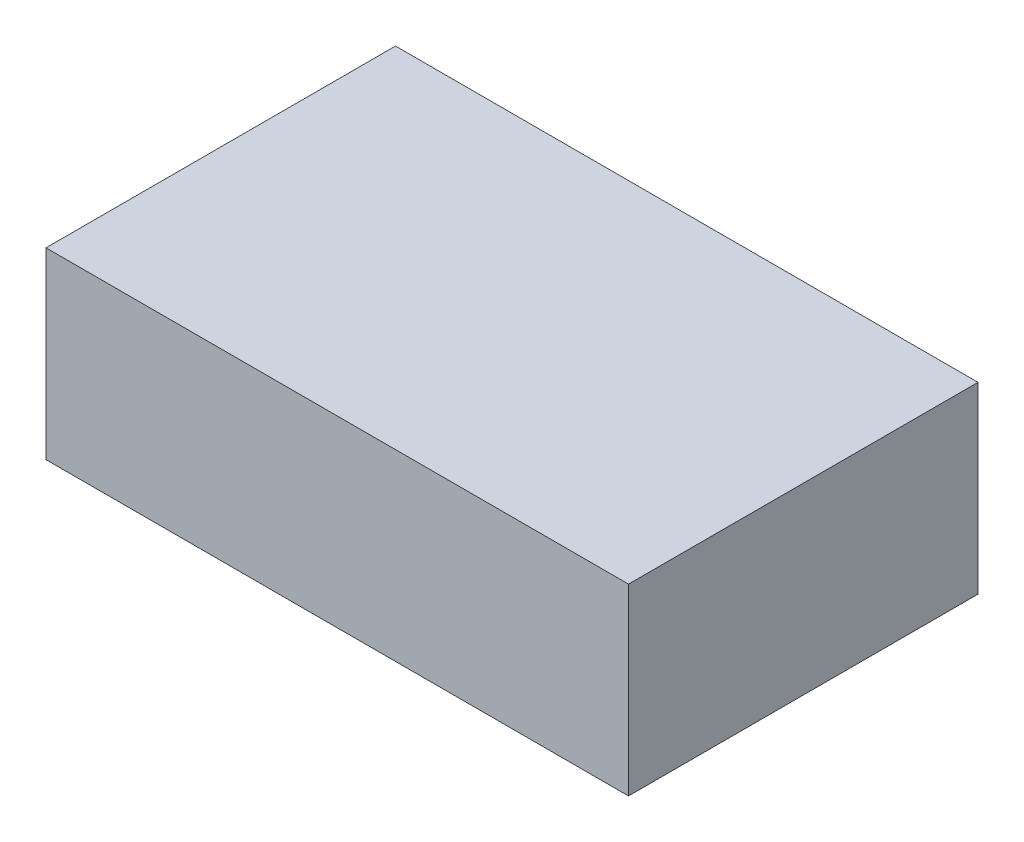
ISO-10303-21;
HEADER;
FILE_DESCRIPTION(('STEP AP214'),'2;1');
FILE_NAME('part.step','',(''),(''),'','','');
FILE_SCHEMA(('AUTOMOTIVE_DESIGN { 1 0 10303 214 1 1 1 1 }'));
ENDSEC;
DATA;
#1=APPLICATION_CONTEXT('core data for automotive mechanical design processes');
#2=APPLICATION_PROTOCOL_DEFINITION('international standard','automotive_design',2000,#1);
#3=PRODUCT_CONTEXT('',#1,'mechanical');
#4=PRODUCT('Part','Part','',(#3));
#5=PRODUCT_RELATED_PRODUCT_CATEGORY('part','',(#4));
#6=PRODUCT_DEFINITION_FORMATION('','',#4);
#7=PRODUCT_DEFINITION_CONTEXT('part definition',#1,'design');
#8=PRODUCT_DEFINITION('design','',#6,#7);
#9=PRODUCT_DEFINITION_SHAPE('','',#8);
#10=(LENGTH_UNIT() NAMED_UNIT(*) SI_UNIT(.MILLI.,.METRE.));
#11=(NAMED_UNIT(*) PLANE_ANGLE_UNIT() SI_UNIT($,.RADIAN.));
#12=(NAMED_UNIT(*) SI_UNIT($,.STERADIAN.) SOLID_ANGLE_UNIT());
#13=UNCERTAINTY_MEASURE_WITH_UNIT(LENGTH_MEASURE(1.E-05),#10,'distance_accuracy_value','');
#14=(GEOMETRIC_REPRESENTATION_CONTEXT(3) GLOBAL_UNCERTAINTY_ASSIGNED_CONTEXT((#13)) GLOBAL_UNIT_ASSIGNED_CONTEXT((#10,
#11,#12)) REPRESENTATION_CONTEXT('',''));
#15=CARTESIAN_POINT('',(0.,0.,0.));
#16=DIRECTION('',(0.,0.,1.));
#17=DIRECTION('',(1.,0.,0.));
#18=AXIS2_PLACEMENT_3D('',#15,#16,#17);
#19=CARTESIAN_POINT('',(0.,12.,0.));
#20=DIRECTION('',(1.,0.,0.));
#21=DIRECTION('',(0.,0.,-1.));
#22=AXIS2_PLACEMENT_3D('',#19,#20,#21);
#23=PLANE('',#22);
#24=DIRECTION('',(0.,0.,1.));
#25=VECTOR('',#24,1.);
#26=CARTESIAN_POINT('',(0.,0.,0.));
#27=LINE('',#26,#25);
#28=CARTESIAN_POINT('',(0.,0.,-22.86));
#29=VERTEX_POINT('',#28);
#30=CARTESIAN_POINT('',(0.,0.,0.));
#31=VERTEX_POINT('',#30);
#32=EDGE_CURVE('E95',#29,#31,#27,.T.);
#33=ORIENTED_EDGE('',*,*,#32,.T.);
#34=DIRECTION('',(0.,-1.,0.));
#35=VECTOR('',#34,1.);
#36=CARTESIAN_POINT('',(0.,12.,0.));
#37=LINE('',#36,#35);
#38=CARTESIAN_POINT('',(0.,12.,0.));
#39=VERTEX_POINT('',#38);
#40=EDGE_CURVE('E11',#39,#31,#37,.T.);
#41=ORIENTED_EDGE('',*,*,#40,.F.);
#42=DIRECTION('',(0.,0.,1.));
#43=VECTOR('',#42,1.);
#44=CARTESIAN_POINT('',(0.,12.,0.));
#45=LINE('',#44,#43);
#46=CARTESIAN_POINT('',(0.,12.,-22.86));
#47=VERTEX_POINT('',#46);
#48=EDGE_CURVE('E83',#47,#39,#45,.T.);
#49=ORIENTED_EDGE('',*,*,#48,.F.);
#50=DIRECTION('',(0.,-1.,0.));
#51=VECTOR('',#50,1.);
#52=CARTESIAN_POINT('',(0.,12.,-22.86));
#53=LINE('',#52,#51);
#54=EDGE_CURVE('E91',#47,#29,#53,.T.);
#55=ORIENTED_EDGE('',*,*,#54,.T.);
#56=EDGE_LOOP('',(#33,#41,#49,#55));
#57=FACE_BOUND('',#56,.T.);
#58=ADVANCED_FACE('F32',(#57),#23,.F.);
#59=CARTESIAN_POINT('',(0.,12.,0.));
#60=DIRECTION('',(0.,0.,-1.));
#61=DIRECTION('',(-1.,0.,0.));
#62=AXIS2_PLACEMENT_3D('',#59,#60,#61);
#63=PLANE('',#62);
#64=DIRECTION('',(1.,0.,0.));
#65=VECTOR('',#64,1.);
#66=CARTESIAN_POINT('',(0.,0.,0.));
#67=LINE('',#66,#65);
#68=CARTESIAN_POINT('',(38.1,0.,0.));
#69=VERTEX_POINT('',#68);
#70=EDGE_CURVE('E87',#31,#69,#67,.T.);
#71=ORIENTED_EDGE('',*,*,#70,.T.);
#72=DIRECTION('',(0.,-1.,0.));
#73=VECTOR('',#72,1.);
#74=CARTESIAN_POINT('',(38.1,12.,0.));
#75=LINE('',#74,#73);
#76=CARTESIAN_POINT('',(38.1,12.,0.));
#77=VERTEX_POINT('',#76);
#78=EDGE_CURVE('E40',#77,#69,#75,.T.);
#79=ORIENTED_EDGE('',*,*,#78,.F.);
#80=DIRECTION('',(1.,0.,0.));
#81=VECTOR('',#80,1.);
#82=CARTESIAN_POINT('',(0.,12.,0.));
#83=LINE('',#82,#81);
#84=EDGE_CURVE('E78',#39,#77,#83,.T.);
#85=ORIENTED_EDGE('',*,*,#84,.F.);
#86=ORIENTED_EDGE('',*,*,#40,.T.);
#87=EDGE_LOOP('',(#71,#79,#85,#86));
#88=FACE_BOUND('',#87,.T.);
#89=ADVANCED_FACE('F86',(#88),#63,.F.);
#90=CARTESIAN_POINT('',(38.1,12.,0.));
#91=DIRECTION('',(-1.,0.,0.));
#92=DIRECTION('',(0.,0.,1.));
#93=AXIS2_PLACEMENT_3D('',#90,#91,#92);
#94=PLANE('',#93);
#95=DIRECTION('',(0.,0.,-1.));
#96=VECTOR('',#95,1.);
#97=CARTESIAN_POINT('',(38.1,0.,0.));
#98=LINE('',#97,#96);
#99=CARTESIAN_POINT('',(38.1,0.,-22.86));
#100=VERTEX_POINT('',#99);
#101=EDGE_CURVE('E65',#69,#100,#98,.T.);
#102=ORIENTED_EDGE('',*,*,#101,.T.);
#103=DIRECTION('',(0.,-1.,0.));
#104=VECTOR('',#103,1.);
#105=CARTESIAN_POINT('',(38.1,12.,-22.86));
#106=LINE('',#105,#104);
#107=CARTESIAN_POINT('',(38.1,12.,-22.86));
#108=VERTEX_POINT('',#107);
#109=EDGE_CURVE('E88',#108,#100,#106,.T.);
#110=ORIENTED_EDGE('',*,*,#109,.F.);
#111=DIRECTION('',(0.,0.,-1.));
#112=VECTOR('',#111,1.);
#113=CARTESIAN_POINT('',(38.1,12.,0.));
#114=LINE('',#113,#112);
#115=EDGE_CURVE('E81',#77,#108,#114,.T.);
#116=ORIENTED_EDGE('',*,*,#115,.F.);
#117=ORIENTED_EDGE('',*,*,#78,.T.);
#118=EDGE_LOOP('',(#102,#110,#116,#117));
#119=FACE_BOUND('',#118,.T.);
#120=ADVANCED_FACE('F89',(#119),#94,.F.);
#121=CARTESIAN_POINT('',(0.,12.,-22.86));
#122=DIRECTION('',(0.,0.,1.));
#123=DIRECTION('',(1.,0.,0.));
#124=AXIS2_PLACEMENT_3D('',#121,#122,#123);
#125=PLANE('',#124);
#126=DIRECTION('',(-1.,0.,0.));
#127=VECTOR('',#126,1.);
#128=CARTESIAN_POINT('',(0.,0.,-22.86));
#129=LINE('',#128,#127);
#130=EDGE_CURVE('E71',#100,#29,#129,.T.);
#131=ORIENTED_EDGE('',*,*,#130,.T.);
#132=ORIENTED_EDGE('',*,*,#54,.F.);
#133=DIRECTION('',(-1.,0.,0.));
#134=VECTOR('',#133,1.);
#135=CARTESIAN_POINT('',(0.,12.,-22.86));
#136=LINE('',#135,#134);
#137=EDGE_CURVE('E48',#108,#47,#136,.T.);
#138=ORIENTED_EDGE('',*,*,#137,.F.);
#139=ORIENTED_EDGE('',*,*,#109,.T.);
#140=EDGE_LOOP('',(#131,#132,#138,#139));
#141=FACE_BOUND('',#140,.T.);
#142=ADVANCED_FACE('F102',(#141),#125,.F.);
#143=CARTESIAN_POINT('',(0.,12.,0.));
#144=DIRECTION('',(0.,-1.,0.));
#145=DIRECTION('',(0.,0.,-1.));
#146=AXIS2_PLACEMENT_3D('',#143,#144,#145);
#147=PLANE('',#146);
#148=ORIENTED_EDGE('',*,*,#48,.T.);
#149=ORIENTED_EDGE('',*,*,#84,.T.);
#150=ORIENTED_EDGE('',*,*,#115,.T.);
#151=ORIENTED_EDGE('',*,*,#137,.T.);
#152=EDGE_LOOP('',(#148,#149,#150,#151));
#153=FACE_BOUND('',#152,.T.);
#154=ADVANCED_FACE('F79',(#153),#147,.F.);
#155=CARTESIAN_POINT('',(0.,0.,0.));
#156=DIRECTION('',(0.,-1.,0.));
#157=DIRECTION('',(0.,0.,-1.));
#158=AXIS2_PLACEMENT_3D('',#155,#156,#157);
#159=PLANE('',#158);
#160=ORIENTED_EDGE('',*,*,#32,.F.);
#161=ORIENTED_EDGE('',*,*,#130,.F.);
#162=ORIENTED_EDGE('',*,*,#101,.F.);
#163=ORIENTED_EDGE('',*,*,#70,.F.);
#164=EDGE_LOOP('',(#160,#161,#162,#163));
#165=FACE_BOUND('',#164,.T.);
#166=ADVANCED_FACE('F105',(#165),#159,.T.);
#167=CLOSED_SHELL('',(#58,#89,#120,#142,#154,#166));
#168=MANIFOLD_SOLID_BREP('B2',#167);
#169=ADVANCED_BREP_SHAPE_REPRESENTATION('',(#18,#168),#14);
#170=SHAPE_DEFINITION_REPRESENTATION(#9,#169);
ENDSEC;
END-ISO-10303-21;
